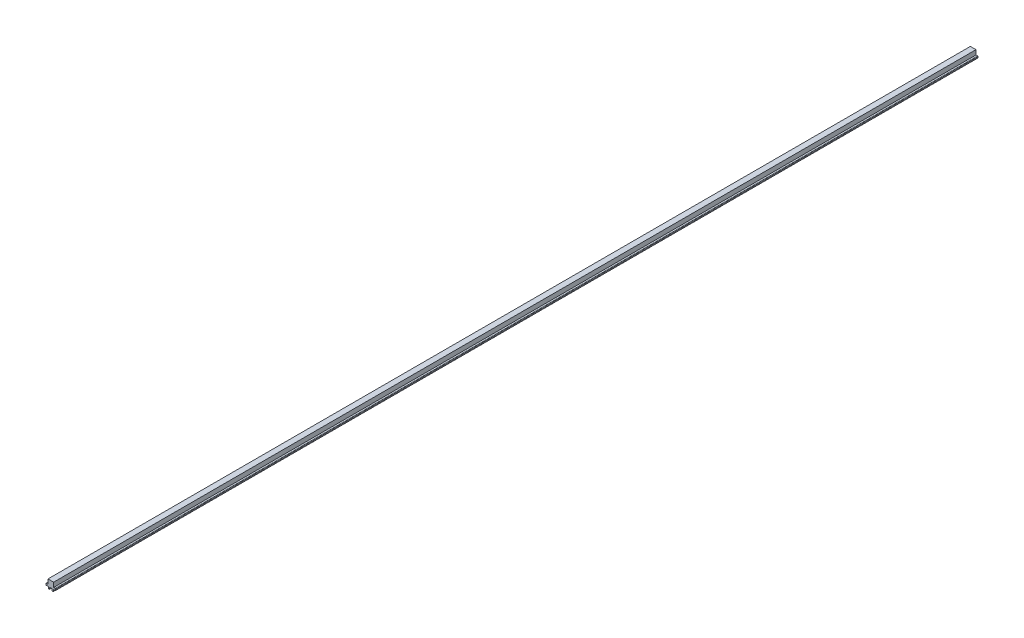
ISO-10303-21;
HEADER;
FILE_DESCRIPTION(('STEP AP214'),'2;1');
FILE_NAME('part.step','',(''),(''),'','','');
FILE_SCHEMA(('AUTOMOTIVE_DESIGN { 1 0 10303 214 1 1 1 1 }'));
ENDSEC;
DATA;
#1=APPLICATION_CONTEXT('core data for automotive mechanical design processes');
#2=APPLICATION_PROTOCOL_DEFINITION('international standard','automotive_design',2000,#1);
#3=PRODUCT_CONTEXT('',#1,'mechanical');
#4=PRODUCT('Part','Part','',(#3));
#5=PRODUCT_RELATED_PRODUCT_CATEGORY('part','',(#4));
#6=PRODUCT_DEFINITION_FORMATION('','',#4);
#7=PRODUCT_DEFINITION_CONTEXT('part definition',#1,'design');
#8=PRODUCT_DEFINITION('design','',#6,#7);
#9=PRODUCT_DEFINITION_SHAPE('','',#8);
#10=(LENGTH_UNIT() NAMED_UNIT(*) SI_UNIT(.MILLI.,.METRE.));
#11=(NAMED_UNIT(*) PLANE_ANGLE_UNIT() SI_UNIT($,.RADIAN.));
#12=(NAMED_UNIT(*) SI_UNIT($,.STERADIAN.) SOLID_ANGLE_UNIT());
#13=UNCERTAINTY_MEASURE_WITH_UNIT(LENGTH_MEASURE(1.E-05),#10,'distance_accuracy_value','');
#14=(GEOMETRIC_REPRESENTATION_CONTEXT(3) GLOBAL_UNCERTAINTY_ASSIGNED_CONTEXT((#13)) GLOBAL_UNIT_ASSIGNED_CONTEXT((#10,
#11,#12)) REPRESENTATION_CONTEXT('',''));
#15=CARTESIAN_POINT('',(0.,0.,0.));
#16=DIRECTION('',(0.,0.,1.));
#17=DIRECTION('',(1.,0.,0.));
#18=AXIS2_PLACEMENT_3D('',#15,#16,#17);
#19=CARTESIAN_POINT('',(0.,5.12684242709043,1000.));
#20=DIRECTION('',(0.,1.,0.));
#21=DIRECTION('',(0.,0.,1.));
#22=AXIS2_PLACEMENT_3D('',#19,#20,#21);
#23=PLANE('',#22);
#24=DIRECTION('',(1.,0.,0.));
#25=VECTOR('',#24,1.);
#26=CARTESIAN_POINT('',(0.,5.12684242709043,0.));
#27=LINE('',#26,#25);
#28=CARTESIAN_POINT('',(-4.46664623906932,5.12684242709043,0.));
#29=VERTEX_POINT('',#28);
#30=CARTESIAN_POINT('',(1.63335376093067,5.12684242709043,0.));
#31=VERTEX_POINT('',#30);
#32=EDGE_CURVE('E207',#29,#31,#27,.T.);
#33=ORIENTED_EDGE('',*,*,#32,.F.);
#34=DIRECTION('',(0.,0.,-1.));
#35=VECTOR('',#34,1.);
#36=CARTESIAN_POINT('',(-4.46664623906932,5.12684242709043,1000.));
#37=LINE('',#36,#35);
#38=CARTESIAN_POINT('',(-4.46664623906932,5.12684242709043,1000.));
#39=VERTEX_POINT('',#38);
#40=EDGE_CURVE('E201',#39,#29,#37,.T.);
#41=ORIENTED_EDGE('',*,*,#40,.F.);
#42=DIRECTION('',(1.,0.,0.));
#43=VECTOR('',#42,1.);
#44=CARTESIAN_POINT('',(0.,5.12684242709043,1000.));
#45=LINE('',#44,#43);
#46=CARTESIAN_POINT('',(1.63335376093067,5.12684242709043,1000.));
#47=VERTEX_POINT('',#46);
#48=EDGE_CURVE('E204',#39,#47,#45,.T.);
#49=ORIENTED_EDGE('',*,*,#48,.T.);
#50=DIRECTION('',(0.,0.,-1.));
#51=VECTOR('',#50,1.);
#52=CARTESIAN_POINT('',(1.63335376093067,5.12684242709043,1000.));
#53=LINE('',#52,#51);
#54=EDGE_CURVE('E265',#47,#31,#53,.T.);
#55=ORIENTED_EDGE('',*,*,#54,.T.);
#56=EDGE_LOOP('',(#33,#41,#49,#55));
#57=FACE_BOUND('',#56,.T.);
#58=ADVANCED_FACE('F36',(#57),#23,.T.);
#59=CARTESIAN_POINT('',(-4.46664623906932,0.,1000.));
#60=DIRECTION('',(1.,0.,0.));
#61=DIRECTION('',(0.,0.,-1.));
#62=AXIS2_PLACEMENT_3D('',#59,#60,#61);
#63=PLANE('',#62);
#64=DIRECTION('',(0.,-1.,0.));
#65=VECTOR('',#64,1.);
#66=CARTESIAN_POINT('',(-4.46664623906932,0.,0.));
#67=LINE('',#66,#65);
#68=CARTESIAN_POINT('',(-4.46664623906932,0.126842427090434,0.));
#69=VERTEX_POINT('',#68);
#70=EDGE_CURVE('E267',#29,#69,#67,.T.);
#71=ORIENTED_EDGE('',*,*,#70,.T.);
#72=DIRECTION('',(0.,0.,-1.));
#73=VECTOR('',#72,1.);
#74=CARTESIAN_POINT('',(-4.46664623906932,0.126842427090434,1000.));
#75=LINE('',#74,#73);
#76=CARTESIAN_POINT('',(-4.46664623906932,0.126842427090434,1000.));
#77=VERTEX_POINT('',#76);
#78=EDGE_CURVE('E211',#77,#69,#75,.T.);
#79=ORIENTED_EDGE('',*,*,#78,.F.);
#80=DIRECTION('',(0.,-1.,0.));
#81=VECTOR('',#80,1.);
#82=CARTESIAN_POINT('',(-4.46664623906932,0.,1000.));
#83=LINE('',#82,#81);
#84=EDGE_CURVE('E214',#39,#77,#83,.T.);
#85=ORIENTED_EDGE('',*,*,#84,.F.);
#86=ORIENTED_EDGE('',*,*,#40,.T.);
#87=EDGE_LOOP('',(#71,#79,#85,#86));
#88=FACE_BOUND('',#87,.T.);
#89=ADVANCED_FACE('F215',(#88),#63,.F.);
#90=CARTESIAN_POINT('',(0.,0.126842427090434,1000.));
#91=DIRECTION('',(0.,-1.,0.));
#92=DIRECTION('',(0.,0.,-1.));
#93=AXIS2_PLACEMENT_3D('',#90,#91,#92);
#94=PLANE('',#93);
#95=DIRECTION('',(-1.,0.,0.));
#96=VECTOR('',#95,1.);
#97=CARTESIAN_POINT('',(0.,0.126842427090434,0.));
#98=LINE('',#97,#96);
#99=CARTESIAN_POINT('',(-6.16664623906933,0.126842427090434,0.));
#100=VERTEX_POINT('',#99);
#101=EDGE_CURVE('E269',#69,#100,#98,.T.);
#102=ORIENTED_EDGE('',*,*,#101,.T.);
#103=DIRECTION('',(0.,0.,-1.));
#104=VECTOR('',#103,1.);
#105=CARTESIAN_POINT('',(-6.16664623906933,0.126842427090434,1000.));
#106=LINE('',#105,#104);
#107=CARTESIAN_POINT('',(-6.16664623906933,0.126842427090434,1000.));
#108=VERTEX_POINT('',#107);
#109=EDGE_CURVE('E351',#100,#108,#106,.F.);
#110=ORIENTED_EDGE('',*,*,#109,.T.);
#111=DIRECTION('',(-1.,0.,0.));
#112=VECTOR('',#111,1.);
#113=CARTESIAN_POINT('',(0.,0.126842427090434,1000.));
#114=LINE('',#113,#112);
#115=EDGE_CURVE('E219',#77,#108,#114,.T.);
#116=ORIENTED_EDGE('',*,*,#115,.F.);
#117=ORIENTED_EDGE('',*,*,#78,.T.);
#118=EDGE_LOOP('',(#102,#110,#116,#117));
#119=FACE_BOUND('',#118,.T.);
#120=ADVANCED_FACE('F427',(#119),#94,.F.);
#121=CARTESIAN_POINT('',(-6.66664623906933,0.,1000.));
#122=DIRECTION('',(1.,0.,0.));
#123=DIRECTION('',(0.,0.,-1.));
#124=AXIS2_PLACEMENT_3D('',#121,#122,#123);
#125=PLANE('',#124);
#126=DIRECTION('',(0.,-1.,0.));
#127=VECTOR('',#126,1.);
#128=CARTESIAN_POINT('',(-6.66664623906933,0.,0.));
#129=LINE('',#128,#127);
#130=CARTESIAN_POINT('',(-6.66664623906933,-0.373157572909566,0.));
#131=VERTEX_POINT('',#130);
#132=CARTESIAN_POINT('',(-6.66664623906933,-1.37315757290957,0.));
#133=VERTEX_POINT('',#132);
#134=EDGE_CURVE('E272',#131,#133,#129,.T.);
#135=ORIENTED_EDGE('',*,*,#134,.T.);
#136=DIRECTION('',(0.,0.,-1.));
#137=VECTOR('',#136,1.);
#138=CARTESIAN_POINT('',(-6.66664623906933,-1.37315757290957,1000.));
#139=LINE('',#138,#137);
#140=CARTESIAN_POINT('',(-6.66664623906933,-1.37315757290957,1000.));
#141=VERTEX_POINT('',#140);
#142=EDGE_CURVE('E349',#133,#141,#139,.F.);
#143=ORIENTED_EDGE('',*,*,#142,.T.);
#144=DIRECTION('',(0.,-1.,0.));
#145=VECTOR('',#144,1.);
#146=CARTESIAN_POINT('',(-6.66664623906933,0.,1000.));
#147=LINE('',#146,#145);
#148=CARTESIAN_POINT('',(-6.66664623906933,-0.373157572909566,1000.));
#149=VERTEX_POINT('',#148);
#150=EDGE_CURVE('E233',#149,#141,#147,.T.);
#151=ORIENTED_EDGE('',*,*,#150,.F.);
#152=DIRECTION('',(0.,0.,-1.));
#153=VECTOR('',#152,1.);
#154=CARTESIAN_POINT('',(-6.66664623906933,-0.373157572909566,1000.));
#155=LINE('',#154,#153);
#156=EDGE_CURVE('E346',#149,#131,#155,.T.);
#157=ORIENTED_EDGE('',*,*,#156,.T.);
#158=EDGE_LOOP('',(#135,#143,#151,#157));
#159=FACE_BOUND('',#158,.T.);
#160=ADVANCED_FACE('F609',(#159),#125,.F.);
#161=CARTESIAN_POINT('',(0.,-1.87315757290957,1000.));
#162=DIRECTION('',(0.,1.,0.));
#163=DIRECTION('',(0.,0.,1.));
#164=AXIS2_PLACEMENT_3D('',#161,#162,#163);
#165=PLANE('',#164);
#166=DIRECTION('',(1.,0.,0.));
#167=VECTOR('',#166,1.);
#168=CARTESIAN_POINT('',(0.,-1.87315757290957,1000.));
#169=LINE('',#168,#167);
#170=CARTESIAN_POINT('',(-6.16664623906933,-1.87315757290957,1000.));
#171=VERTEX_POINT('',#170);
#172=CARTESIAN_POINT('',(-4.21664623906933,-1.87315757290957,1000.));
#173=VERTEX_POINT('',#172);
#174=EDGE_CURVE('E236',#171,#173,#169,.T.);
#175=ORIENTED_EDGE('',*,*,#174,.F.);
#176=DIRECTION('',(0.,0.,-1.));
#177=VECTOR('',#176,1.);
#178=CARTESIAN_POINT('',(-6.16664623906933,-1.87315757290957,1000.));
#179=LINE('',#178,#177);
#180=CARTESIAN_POINT('',(-6.16664623906933,-1.87315757290957,0.));
#181=VERTEX_POINT('',#180);
#182=EDGE_CURVE('E343',#171,#181,#179,.T.);
#183=ORIENTED_EDGE('',*,*,#182,.T.);
#184=DIRECTION('',(1.,0.,0.));
#185=VECTOR('',#184,1.);
#186=CARTESIAN_POINT('',(0.,-1.87315757290957,0.));
#187=LINE('',#186,#185);
#188=CARTESIAN_POINT('',(-4.21664623906933,-1.87315757290957,0.));
#189=VERTEX_POINT('',#188);
#190=EDGE_CURVE('E275',#181,#189,#187,.T.);
#191=ORIENTED_EDGE('',*,*,#190,.T.);
#192=DIRECTION('',(0.,0.,-1.));
#193=VECTOR('',#192,1.);
#194=CARTESIAN_POINT('',(-4.21664623906933,-1.87315757290957,1000.));
#195=LINE('',#194,#193);
#196=EDGE_CURVE('E314',#173,#189,#195,.T.);
#197=ORIENTED_EDGE('',*,*,#196,.F.);
#198=EDGE_LOOP('',(#175,#183,#191,#197));
#199=FACE_BOUND('',#198,.T.);
#200=ADVANCED_FACE('F548',(#199),#165,.F.);
#201=CARTESIAN_POINT('',(-4.21664623906933,0.,1000.));
#202=DIRECTION('',(1.,0.,0.));
#203=DIRECTION('',(0.,0.,-1.));
#204=AXIS2_PLACEMENT_3D('',#201,#202,#203);
#205=PLANE('',#204);
#206=DIRECTION('',(0.,-1.,0.));
#207=VECTOR('',#206,1.);
#208=CARTESIAN_POINT('',(-4.21664623906933,0.,0.));
#209=LINE('',#208,#207);
#210=CARTESIAN_POINT('',(-4.21664623906933,-3.57315757290957,0.));
#211=VERTEX_POINT('',#210);
#212=EDGE_CURVE('E277',#189,#211,#209,.T.);
#213=ORIENTED_EDGE('',*,*,#212,.T.);
#214=DIRECTION('',(0.,0.,-1.));
#215=VECTOR('',#214,1.);
#216=CARTESIAN_POINT('',(-4.21664623906933,-3.57315757290957,1000.));
#217=LINE('',#216,#215);
#218=CARTESIAN_POINT('',(-4.21664623906933,-3.57315757290957,1000.));
#219=VERTEX_POINT('',#218);
#220=EDGE_CURVE('E44',#211,#219,#217,.F.);
#221=ORIENTED_EDGE('',*,*,#220,.T.);
#222=DIRECTION('',(0.,-1.,0.));
#223=VECTOR('',#222,1.);
#224=CARTESIAN_POINT('',(-4.21664623906933,0.,1000.));
#225=LINE('',#224,#223);
#226=EDGE_CURVE('E238',#173,#219,#225,.T.);
#227=ORIENTED_EDGE('',*,*,#226,.F.);
#228=ORIENTED_EDGE('',*,*,#196,.T.);
#229=EDGE_LOOP('',(#213,#221,#227,#228));
#230=FACE_BOUND('',#229,.T.);
#231=ADVANCED_FACE('F384',(#230),#205,.F.);
#232=CARTESIAN_POINT('',(0.,-4.07315757290957,1000.));
#233=DIRECTION('',(0.,-1.,0.));
#234=DIRECTION('',(0.,0.,-1.));
#235=AXIS2_PLACEMENT_3D('',#232,#233,#234);
#236=PLANE('',#235);
#237=DIRECTION('',(-1.,0.,0.));
#238=VECTOR('',#237,1.);
#239=CARTESIAN_POINT('',(0.,-4.07315757290957,1000.));
#240=LINE('',#239,#238);
#241=CARTESIAN_POINT('',(-3.21664623906933,-4.07315757290957,1000.));
#242=VERTEX_POINT('',#241);
#243=CARTESIAN_POINT('',(-3.71664623906933,-4.07315757290957,1000.));
#244=VERTEX_POINT('',#243);
#245=EDGE_CURVE('E241',#242,#244,#240,.T.);
#246=ORIENTED_EDGE('',*,*,#245,.T.);
#247=DIRECTION('',(0.,0.,-1.));
#248=VECTOR('',#247,1.);
#249=CARTESIAN_POINT('',(-3.71664623906933,-4.07315757290957,0.));
#250=LINE('',#249,#248);
#251=CARTESIAN_POINT('',(-3.71664623906933,-4.07315757290957,0.));
#252=VERTEX_POINT('',#251);
#253=EDGE_CURVE('E379',#244,#252,#250,.T.);
#254=ORIENTED_EDGE('',*,*,#253,.T.);
#255=DIRECTION('',(-1.,0.,0.));
#256=VECTOR('',#255,1.);
#257=CARTESIAN_POINT('',(0.,-4.07315757290957,0.));
#258=LINE('',#257,#256);
#259=CARTESIAN_POINT('',(-3.21664623906933,-4.07315757290957,0.));
#260=VERTEX_POINT('',#259);
#261=EDGE_CURVE('E280',#260,#252,#258,.T.);
#262=ORIENTED_EDGE('',*,*,#261,.F.);
#263=DIRECTION('',(0.,0.,-1.));
#264=VECTOR('',#263,1.);
#265=CARTESIAN_POINT('',(-3.21664623906933,-4.07315757290957,1000.));
#266=LINE('',#265,#264);
#267=EDGE_CURVE('E377',#260,#242,#266,.F.);
#268=ORIENTED_EDGE('',*,*,#267,.T.);
#269=EDGE_LOOP('',(#246,#254,#262,#268));
#270=FACE_BOUND('',#269,.T.);
#271=ADVANCED_FACE('F394',(#270),#236,.T.);
#272=CARTESIAN_POINT('',(-2.71664623906933,0.,1000.));
#273=DIRECTION('',(1.,0.,0.));
#274=DIRECTION('',(0.,0.,-1.));
#275=AXIS2_PLACEMENT_3D('',#272,#273,#274);
#276=PLANE('',#275);
#277=DIRECTION('',(0.,-1.,0.));
#278=VECTOR('',#277,1.);
#279=CARTESIAN_POINT('',(-2.71664623906933,0.,1000.));
#280=LINE('',#279,#278);
#281=CARTESIAN_POINT('',(-2.71664623906933,-1.87315757290957,1000.));
#282=VERTEX_POINT('',#281);
#283=CARTESIAN_POINT('',(-2.71664623906933,-3.57315757290957,1000.));
#284=VERTEX_POINT('',#283);
#285=EDGE_CURVE('E244',#282,#284,#280,.T.);
#286=ORIENTED_EDGE('',*,*,#285,.T.);
#287=DIRECTION('',(0.,0.,-1.));
#288=VECTOR('',#287,1.);
#289=CARTESIAN_POINT('',(-2.71664623906933,-3.57315757290957,1000.));
#290=LINE('',#289,#288);
#291=CARTESIAN_POINT('',(-2.71664623906933,-3.57315757290957,0.));
#292=VERTEX_POINT('',#291);
#293=EDGE_CURVE('E11',#284,#292,#290,.T.);
#294=ORIENTED_EDGE('',*,*,#293,.T.);
#295=DIRECTION('',(0.,-1.,0.));
#296=VECTOR('',#295,1.);
#297=CARTESIAN_POINT('',(-2.71664623906933,0.,0.));
#298=LINE('',#297,#296);
#299=CARTESIAN_POINT('',(-2.71664623906933,-1.87315757290957,0.));
#300=VERTEX_POINT('',#299);
#301=EDGE_CURVE('E283',#300,#292,#298,.T.);
#302=ORIENTED_EDGE('',*,*,#301,.F.);
#303=DIRECTION('',(0.,0.,-1.));
#304=VECTOR('',#303,1.);
#305=CARTESIAN_POINT('',(-2.71664623906933,-1.87315757290957,1000.));
#306=LINE('',#305,#304);
#307=EDGE_CURVE('E312',#282,#300,#306,.T.);
#308=ORIENTED_EDGE('',*,*,#307,.F.);
#309=EDGE_LOOP('',(#286,#294,#302,#308));
#310=FACE_BOUND('',#309,.T.);
#311=ADVANCED_FACE('F403',(#310),#276,.T.);
#312=CARTESIAN_POINT('',(0.,-1.87315757290957,1000.));
#313=DIRECTION('',(0.,1.,0.));
#314=DIRECTION('',(0.,0.,1.));
#315=AXIS2_PLACEMENT_3D('',#312,#313,#314);
#316=PLANE('',#315);
#317=DIRECTION('',(1.,0.,0.));
#318=VECTOR('',#317,1.);
#319=CARTESIAN_POINT('',(0.,-1.87315757290957,0.));
#320=LINE('',#319,#318);
#321=CARTESIAN_POINT('',(-0.116646239069324,-1.87315757290957,0.));
#322=VERTEX_POINT('',#321);
#323=EDGE_CURVE('E286',#300,#322,#320,.T.);
#324=ORIENTED_EDGE('',*,*,#323,.T.);
#325=DIRECTION('',(0.,0.,-1.));
#326=VECTOR('',#325,1.);
#327=CARTESIAN_POINT('',(-0.116646239069324,-1.87315757290957,1000.));
#328=LINE('',#327,#326);
#329=CARTESIAN_POINT('',(-0.116646239069324,-1.87315757290957,1000.));
#330=VERTEX_POINT('',#329);
#331=EDGE_CURVE('E309',#330,#322,#328,.T.);
#332=ORIENTED_EDGE('',*,*,#331,.F.);
#333=DIRECTION('',(1.,0.,0.));
#334=VECTOR('',#333,1.);
#335=CARTESIAN_POINT('',(0.,-1.87315757290957,1000.));
#336=LINE('',#335,#334);
#337=EDGE_CURVE('E246',#282,#330,#336,.T.);
#338=ORIENTED_EDGE('',*,*,#337,.F.);
#339=ORIENTED_EDGE('',*,*,#307,.T.);
#340=EDGE_LOOP('',(#324,#332,#338,#339));
#341=FACE_BOUND('',#340,.T.);
#342=ADVANCED_FACE('F408',(#341),#316,.F.);
#343=CARTESIAN_POINT('',(-0.116646239069324,0.,1000.));
#344=DIRECTION('',(1.,0.,0.));
#345=DIRECTION('',(0.,0.,-1.));
#346=AXIS2_PLACEMENT_3D('',#343,#344,#345);
#347=PLANE('',#346);
#348=DIRECTION('',(0.,-1.,0.));
#349=VECTOR('',#348,1.);
#350=CARTESIAN_POINT('',(-0.116646239069324,0.,0.));
#351=LINE('',#350,#349);
#352=CARTESIAN_POINT('',(-0.116646239069324,-3.57315757290957,0.));
#353=VERTEX_POINT('',#352);
#354=EDGE_CURVE('E288',#322,#353,#351,.T.);
#355=ORIENTED_EDGE('',*,*,#354,.T.);
#356=DIRECTION('',(0.,0.,-1.));
#357=VECTOR('',#356,1.);
#358=CARTESIAN_POINT('',(-0.116646239069324,-3.57315757290957,1000.));
#359=LINE('',#358,#357);
#360=CARTESIAN_POINT('',(-0.116646239069324,-3.57315757290957,1000.));
#361=VERTEX_POINT('',#360);
#362=EDGE_CURVE('E51',#353,#361,#359,.F.);
#363=ORIENTED_EDGE('',*,*,#362,.T.);
#364=DIRECTION('',(0.,-1.,0.));
#365=VECTOR('',#364,1.);
#366=CARTESIAN_POINT('',(-0.116646239069324,0.,1000.));
#367=LINE('',#366,#365);
#368=EDGE_CURVE('E248',#330,#361,#367,.T.);
#369=ORIENTED_EDGE('',*,*,#368,.F.);
#370=ORIENTED_EDGE('',*,*,#331,.T.);
#371=EDGE_LOOP('',(#355,#363,#369,#370));
#372=FACE_BOUND('',#371,.T.);
#373=ADVANCED_FACE('F410',(#372),#347,.F.);
#374=CARTESIAN_POINT('',(0.,-4.07315757290957,1000.));
#375=DIRECTION('',(0.,1.,0.));
#376=DIRECTION('',(0.,0.,1.));
#377=AXIS2_PLACEMENT_3D('',#374,#375,#376);
#378=PLANE('',#377);
#379=DIRECTION('',(1.,0.,0.));
#380=VECTOR('',#379,1.);
#381=CARTESIAN_POINT('',(0.,-4.07315757290957,0.));
#382=LINE('',#381,#380);
#383=CARTESIAN_POINT('',(0.383353760930676,-4.07315757290957,0.));
#384=VERTEX_POINT('',#383);
#385=CARTESIAN_POINT('',(0.883353760930676,-4.07315757290957,0.));
#386=VERTEX_POINT('',#385);
#387=EDGE_CURVE('E290',#384,#386,#382,.T.);
#388=ORIENTED_EDGE('',*,*,#387,.T.);
#389=DIRECTION('',(0.,0.,-1.));
#390=VECTOR('',#389,1.);
#391=CARTESIAN_POINT('',(0.883353760930676,-4.07315757290957,1000.));
#392=LINE('',#391,#390);
#393=CARTESIAN_POINT('',(0.883353760930676,-4.07315757290957,1000.));
#394=VERTEX_POINT('',#393);
#395=EDGE_CURVE('E367',#386,#394,#392,.F.);
#396=ORIENTED_EDGE('',*,*,#395,.T.);
#397=DIRECTION('',(1.,0.,0.));
#398=VECTOR('',#397,1.);
#399=CARTESIAN_POINT('',(0.,-4.07315757290957,1000.));
#400=LINE('',#399,#398);
#401=CARTESIAN_POINT('',(0.383353760930676,-4.07315757290957,1000.));
#402=VERTEX_POINT('',#401);
#403=EDGE_CURVE('E250',#402,#394,#400,.T.);
#404=ORIENTED_EDGE('',*,*,#403,.F.);
#405=DIRECTION('',(0.,0.,-1.));
#406=VECTOR('',#405,1.);
#407=CARTESIAN_POINT('',(0.383353760930676,-4.07315757290957,1000.));
#408=LINE('',#407,#406);
#409=EDGE_CURVE('E364',#402,#384,#408,.T.);
#410=ORIENTED_EDGE('',*,*,#409,.T.);
#411=EDGE_LOOP('',(#388,#396,#404,#410));
#412=FACE_BOUND('',#411,.T.);
#413=ADVANCED_FACE('F412',(#412),#378,.F.);
#414=CARTESIAN_POINT('',(1.38335376093068,0.,1000.));
#415=DIRECTION('',(1.,0.,0.));
#416=DIRECTION('',(0.,0.,-1.));
#417=AXIS2_PLACEMENT_3D('',#414,#415,#416);
#418=PLANE('',#417);
#419=DIRECTION('',(0.,-1.,0.));
#420=VECTOR('',#419,1.);
#421=CARTESIAN_POINT('',(1.38335376093068,0.,1000.));
#422=LINE('',#421,#420);
#423=CARTESIAN_POINT('',(1.38335376093068,-1.87315757290957,1000.));
#424=VERTEX_POINT('',#423);
#425=CARTESIAN_POINT('',(1.38335376093068,-3.57315757290957,1000.));
#426=VERTEX_POINT('',#425);
#427=EDGE_CURVE('E252',#424,#426,#422,.T.);
#428=ORIENTED_EDGE('',*,*,#427,.T.);
#429=DIRECTION('',(0.,0.,-1.));
#430=VECTOR('',#429,1.);
#431=CARTESIAN_POINT('',(1.38335376093068,-3.57315757290957,0.));
#432=LINE('',#431,#430);
#433=CARTESIAN_POINT('',(1.38335376093068,-3.57315757290957,0.));
#434=VERTEX_POINT('',#433);
#435=EDGE_CURVE('E353',#426,#434,#432,.T.);
#436=ORIENTED_EDGE('',*,*,#435,.T.);
#437=DIRECTION('',(0.,-1.,0.));
#438=VECTOR('',#437,1.);
#439=CARTESIAN_POINT('',(1.38335376093068,0.,0.));
#440=LINE('',#439,#438);
#441=CARTESIAN_POINT('',(1.38335376093068,-1.87315757290957,0.));
#442=VERTEX_POINT('',#441);
#443=EDGE_CURVE('E293',#442,#434,#440,.T.);
#444=ORIENTED_EDGE('',*,*,#443,.F.);
#445=DIRECTION('',(0.,0.,-1.));
#446=VECTOR('',#445,1.);
#447=CARTESIAN_POINT('',(1.38335376093068,-1.87315757290957,1000.));
#448=LINE('',#447,#446);
#449=EDGE_CURVE('E307',#424,#442,#448,.T.);
#450=ORIENTED_EDGE('',*,*,#449,.F.);
#451=EDGE_LOOP('',(#428,#436,#444,#450));
#452=FACE_BOUND('',#451,.T.);
#453=ADVANCED_FACE('F418',(#452),#418,.T.);
#454=CARTESIAN_POINT('',(0.,-1.87315757290957,1000.));
#455=DIRECTION('',(0.,1.,0.));
#456=DIRECTION('',(0.,0.,1.));
#457=AXIS2_PLACEMENT_3D('',#454,#455,#456);
#458=PLANE('',#457);
#459=DIRECTION('',(1.,0.,0.));
#460=VECTOR('',#459,1.);
#461=CARTESIAN_POINT('',(0.,-1.87315757290957,0.));
#462=LINE('',#461,#460);
#463=CARTESIAN_POINT('',(3.33335376093068,-1.87315757290957,0.));
#464=VERTEX_POINT('',#463);
#465=EDGE_CURVE('E296',#442,#464,#462,.T.);
#466=ORIENTED_EDGE('',*,*,#465,.T.);
#467=DIRECTION('',(0.,0.,-1.));
#468=VECTOR('',#467,1.);
#469=CARTESIAN_POINT('',(3.33335376093068,-1.87315757290957,1000.));
#470=LINE('',#469,#468);
#471=CARTESIAN_POINT('',(3.33335376093068,-1.87315757290957,1000.));
#472=VERTEX_POINT('',#471);
#473=EDGE_CURVE('E330',#464,#472,#470,.F.);
#474=ORIENTED_EDGE('',*,*,#473,.T.);
#475=DIRECTION('',(1.,0.,0.));
#476=VECTOR('',#475,1.);
#477=CARTESIAN_POINT('',(0.,-1.87315757290957,1000.));
#478=LINE('',#477,#476);
#479=EDGE_CURVE('E255',#424,#472,#478,.T.);
#480=ORIENTED_EDGE('',*,*,#479,.F.);
#481=ORIENTED_EDGE('',*,*,#449,.T.);
#482=EDGE_LOOP('',(#466,#474,#480,#481));
#483=FACE_BOUND('',#482,.T.);
#484=ADVANCED_FACE('F508',(#483),#458,.F.);
#485=CARTESIAN_POINT('',(3.83335376093068,0.,1000.));
#486=DIRECTION('',(1.,0.,0.));
#487=DIRECTION('',(0.,0.,-1.));
#488=AXIS2_PLACEMENT_3D('',#485,#486,#487);
#489=PLANE('',#488);
#490=DIRECTION('',(0.,-1.,0.));
#491=VECTOR('',#490,1.);
#492=CARTESIAN_POINT('',(3.83335376093068,0.,1000.));
#493=LINE('',#492,#491);
#494=CARTESIAN_POINT('',(3.83335376093068,-0.373157572909566,1000.));
#495=VERTEX_POINT('',#494);
#496=CARTESIAN_POINT('',(3.83335376093068,-1.37315757290957,1000.));
#497=VERTEX_POINT('',#496);
#498=EDGE_CURVE('E258',#495,#497,#493,.T.);
#499=ORIENTED_EDGE('',*,*,#498,.T.);
#500=DIRECTION('',(0.,0.,-1.));
#501=VECTOR('',#500,1.);
#502=CARTESIAN_POINT('',(3.83335376093068,-1.37315757290957,0.));
#503=LINE('',#502,#501);
#504=CARTESIAN_POINT('',(3.83335376093068,-1.37315757290957,0.));
#505=VERTEX_POINT('',#504);
#506=EDGE_CURVE('E319',#497,#505,#503,.T.);
#507=ORIENTED_EDGE('',*,*,#506,.T.);
#508=DIRECTION('',(0.,-1.,0.));
#509=VECTOR('',#508,1.);
#510=CARTESIAN_POINT('',(3.83335376093068,0.,0.));
#511=LINE('',#510,#509);
#512=CARTESIAN_POINT('',(3.83335376093068,-0.373157572909566,0.));
#513=VERTEX_POINT('',#512);
#514=EDGE_CURVE('E299',#513,#505,#511,.T.);
#515=ORIENTED_EDGE('',*,*,#514,.F.);
#516=DIRECTION('',(0.,0.,-1.));
#517=VECTOR('',#516,1.);
#518=CARTESIAN_POINT('',(3.83335376093068,-0.373157572909566,1000.));
#519=LINE('',#518,#517);
#520=EDGE_CURVE('E210',#513,#495,#519,.F.);
#521=ORIENTED_EDGE('',*,*,#520,.T.);
#522=EDGE_LOOP('',(#499,#507,#515,#521));
#523=FACE_BOUND('',#522,.T.);
#524=ADVANCED_FACE('F582',(#523),#489,.T.);
#525=CARTESIAN_POINT('',(0.,0.126842427090434,1000.));
#526=DIRECTION('',(0.,1.,0.));
#527=DIRECTION('',(0.,0.,1.));
#528=AXIS2_PLACEMENT_3D('',#525,#526,#527);
#529=PLANE('',#528);
#530=DIRECTION('',(1.,0.,0.));
#531=VECTOR('',#530,1.);
#532=CARTESIAN_POINT('',(0.,0.126842427090434,1000.));
#533=LINE('',#532,#531);
#534=CARTESIAN_POINT('',(1.63335376093067,0.126842427090434,1000.));
#535=VERTEX_POINT('',#534);
#536=CARTESIAN_POINT('',(3.33335376093068,0.126842427090434,1000.));
#537=VERTEX_POINT('',#536);
#538=EDGE_CURVE('E261',#535,#537,#533,.T.);
#539=ORIENTED_EDGE('',*,*,#538,.T.);
#540=DIRECTION('',(0.,0.,-1.));
#541=VECTOR('',#540,1.);
#542=CARTESIAN_POINT('',(3.33335376093068,0.126842427090434,1000.));
#543=LINE('',#542,#541);
#544=CARTESIAN_POINT('',(3.33335376093068,0.126842427090434,0.));
#545=VERTEX_POINT('',#544);
#546=EDGE_CURVE('E340',#537,#545,#543,.T.);
#547=ORIENTED_EDGE('',*,*,#546,.T.);
#548=DIRECTION('',(1.,0.,0.));
#549=VECTOR('',#548,1.);
#550=CARTESIAN_POINT('',(0.,0.126842427090434,0.));
#551=LINE('',#550,#549);
#552=CARTESIAN_POINT('',(1.63335376093067,0.126842427090434,0.));
#553=VERTEX_POINT('',#552);
#554=EDGE_CURVE('E229',#553,#545,#551,.T.);
#555=ORIENTED_EDGE('',*,*,#554,.F.);
#556=DIRECTION('',(0.,0.,-1.));
#557=VECTOR('',#556,1.);
#558=CARTESIAN_POINT('',(1.63335376093067,0.126842427090434,1000.));
#559=LINE('',#558,#557);
#560=EDGE_CURVE('E305',#535,#553,#559,.T.);
#561=ORIENTED_EDGE('',*,*,#560,.F.);
#562=EDGE_LOOP('',(#539,#547,#555,#561));
#563=FACE_BOUND('',#562,.T.);
#564=ADVANCED_FACE('F577',(#563),#529,.T.);
#565=CARTESIAN_POINT('',(1.63335376093067,0.,1000.));
#566=DIRECTION('',(1.,0.,0.));
#567=DIRECTION('',(0.,0.,-1.));
#568=AXIS2_PLACEMENT_3D('',#565,#566,#567);
#569=PLANE('',#568);
#570=DIRECTION('',(0.,-1.,0.));
#571=VECTOR('',#570,1.);
#572=CARTESIAN_POINT('',(1.63335376093067,0.,0.));
#573=LINE('',#572,#571);
#574=EDGE_CURVE('E226',#31,#553,#573,.T.);
#575=ORIENTED_EDGE('',*,*,#574,.F.);
#576=ORIENTED_EDGE('',*,*,#54,.F.);
#577=DIRECTION('',(0.,-1.,0.));
#578=VECTOR('',#577,1.);
#579=CARTESIAN_POINT('',(1.63335376093067,0.,1000.));
#580=LINE('',#579,#578);
#581=EDGE_CURVE('E225',#47,#535,#580,.T.);
#582=ORIENTED_EDGE('',*,*,#581,.T.);
#583=ORIENTED_EDGE('',*,*,#560,.T.);
#584=EDGE_LOOP('',(#575,#576,#582,#583));
#585=FACE_BOUND('',#584,.T.);
#586=ADVANCED_FACE('F496',(#585),#569,.T.);
#587=CARTESIAN_POINT('',(0.,0.,1000.));
#588=DIRECTION('',(0.,0.,1.));
#589=DIRECTION('',(1.,0.,0.));
#590=AXIS2_PLACEMENT_3D('',#587,#588,#589);
#591=PLANE('',#590);
#592=ORIENTED_EDGE('',*,*,#403,.T.);
#593=CARTESIAN_POINT('',(0.883353760930676,-3.57315757290957,1000.));
#594=DIRECTION('',(0.,0.,1.));
#595=DIRECTION('',(1.,0.,0.));
#596=AXIS2_PLACEMENT_3D('',#593,#594,#595);
#597=CIRCLE('',#596,0.5);
#598=EDGE_CURVE('E374',#394,#426,#597,.T.);
#599=ORIENTED_EDGE('',*,*,#598,.T.);
#600=ORIENTED_EDGE('',*,*,#427,.F.);
#601=ORIENTED_EDGE('',*,*,#479,.T.);
#602=CARTESIAN_POINT('',(3.33335376093068,-1.37315757290957,1000.));
#603=DIRECTION('',(0.,0.,1.));
#604=DIRECTION('',(1.,0.,0.));
#605=AXIS2_PLACEMENT_3D('',#602,#603,#604);
#606=CIRCLE('',#605,0.5);
#607=EDGE_CURVE('E338',#472,#497,#606,.T.);
#608=ORIENTED_EDGE('',*,*,#607,.T.);
#609=ORIENTED_EDGE('',*,*,#498,.F.);
#610=CARTESIAN_POINT('',(3.33335376093068,-0.373157572909566,1000.));
#611=DIRECTION('',(0.,0.,1.));
#612=DIRECTION('',(1.,0.,0.));
#613=AXIS2_PLACEMENT_3D('',#610,#611,#612);
#614=CIRCLE('',#613,0.5);
#615=EDGE_CURVE('E336',#495,#537,#614,.T.);
#616=ORIENTED_EDGE('',*,*,#615,.T.);
#617=ORIENTED_EDGE('',*,*,#538,.F.);
#618=ORIENTED_EDGE('',*,*,#581,.F.);
#619=ORIENTED_EDGE('',*,*,#48,.F.);
#620=ORIENTED_EDGE('',*,*,#84,.T.);
#621=ORIENTED_EDGE('',*,*,#115,.T.);
#622=CARTESIAN_POINT('',(-6.16664623906933,-0.373157572909566,1000.));
#623=DIRECTION('',(0.,0.,1.));
#624=DIRECTION('',(1.,0.,0.));
#625=AXIS2_PLACEMENT_3D('',#622,#623,#624);
#626=CIRCLE('',#625,0.5);
#627=EDGE_CURVE('E332',#108,#149,#626,.T.);
#628=ORIENTED_EDGE('',*,*,#627,.T.);
#629=ORIENTED_EDGE('',*,*,#150,.T.);
#630=CARTESIAN_POINT('',(-6.16664623906933,-1.37315757290957,1000.));
#631=DIRECTION('',(0.,0.,1.));
#632=DIRECTION('',(1.,0.,0.));
#633=AXIS2_PLACEMENT_3D('',#630,#631,#632);
#634=CIRCLE('',#633,0.5);
#635=EDGE_CURVE('E334',#141,#171,#634,.T.);
#636=ORIENTED_EDGE('',*,*,#635,.T.);
#637=ORIENTED_EDGE('',*,*,#174,.T.);
#638=ORIENTED_EDGE('',*,*,#226,.T.);
#639=CARTESIAN_POINT('',(-3.71664623906933,-3.57315757290957,1000.));
#640=DIRECTION('',(0.,0.,1.));
#641=DIRECTION('',(1.,0.,0.));
#642=AXIS2_PLACEMENT_3D('',#639,#640,#641);
#643=CIRCLE('',#642,0.5);
#644=EDGE_CURVE('E370',#219,#244,#643,.T.);
#645=ORIENTED_EDGE('',*,*,#644,.T.);
#646=ORIENTED_EDGE('',*,*,#245,.F.);
#647=CARTESIAN_POINT('',(-3.21664623906933,-3.57315757290957,1000.));
#648=DIRECTION('',(0.,0.,1.));
#649=DIRECTION('',(1.,0.,0.));
#650=AXIS2_PLACEMENT_3D('',#647,#648,#649);
#651=CIRCLE('',#650,0.5);
#652=EDGE_CURVE('E59',#242,#284,#651,.T.);
#653=ORIENTED_EDGE('',*,*,#652,.T.);
#654=ORIENTED_EDGE('',*,*,#285,.F.);
#655=ORIENTED_EDGE('',*,*,#337,.T.);
#656=ORIENTED_EDGE('',*,*,#368,.T.);
#657=CARTESIAN_POINT('',(0.383353760930676,-3.57315757290957,1000.));
#658=DIRECTION('',(0.,0.,1.));
#659=DIRECTION('',(1.,0.,0.));
#660=AXIS2_PLACEMENT_3D('',#657,#658,#659);
#661=CIRCLE('',#660,0.5);
#662=EDGE_CURVE('E372',#361,#402,#661,.T.);
#663=ORIENTED_EDGE('',*,*,#662,.T.);
#664=EDGE_LOOP('',(#592,#599,#600,#601,#608,#609,#616,#617,#618,#619,#620,#621,#628,#629,#636,
#637,#638,#645,#646,#653,#654,#655,#656,#663));
#665=FACE_BOUND('',#664,.T.);
#666=ADVANCED_FACE('F222',(#665),#591,.T.);
#667=CARTESIAN_POINT('',(0.,0.,0.));
#668=DIRECTION('',(0.,0.,1.));
#669=DIRECTION('',(1.,0.,0.));
#670=AXIS2_PLACEMENT_3D('',#667,#668,#669);
#671=PLANE('',#670);
#672=ORIENTED_EDGE('',*,*,#443,.T.);
#673=CARTESIAN_POINT('',(0.883353760930676,-3.57315757290957,0.));
#674=DIRECTION('',(0.,0.,1.));
#675=DIRECTION('',(1.,0.,0.));
#676=AXIS2_PLACEMENT_3D('',#673,#674,#675);
#677=CIRCLE('',#676,0.5);
#678=EDGE_CURVE('E362',#434,#386,#677,.F.);
#679=ORIENTED_EDGE('',*,*,#678,.T.);
#680=ORIENTED_EDGE('',*,*,#387,.F.);
#681=CARTESIAN_POINT('',(0.383353760930676,-3.57315757290957,0.));
#682=DIRECTION('',(0.,0.,1.));
#683=DIRECTION('',(1.,0.,0.));
#684=AXIS2_PLACEMENT_3D('',#681,#682,#683);
#685=CIRCLE('',#684,0.5);
#686=EDGE_CURVE('E360',#384,#353,#685,.F.);
#687=ORIENTED_EDGE('',*,*,#686,.T.);
#688=ORIENTED_EDGE('',*,*,#354,.F.);
#689=ORIENTED_EDGE('',*,*,#323,.F.);
#690=ORIENTED_EDGE('',*,*,#301,.T.);
#691=CARTESIAN_POINT('',(-3.21664623906933,-3.57315757290957,0.));
#692=DIRECTION('',(0.,0.,1.));
#693=DIRECTION('',(1.,0.,0.));
#694=AXIS2_PLACEMENT_3D('',#691,#692,#693);
#695=CIRCLE('',#694,0.5);
#696=EDGE_CURVE('E356',#292,#260,#695,.F.);
#697=ORIENTED_EDGE('',*,*,#696,.T.);
#698=ORIENTED_EDGE('',*,*,#261,.T.);
#699=CARTESIAN_POINT('',(-3.71664623906933,-3.57315757290957,0.));
#700=DIRECTION('',(0.,0.,1.));
#701=DIRECTION('',(1.,0.,0.));
#702=AXIS2_PLACEMENT_3D('',#699,#700,#701);
#703=CIRCLE('',#702,0.5);
#704=EDGE_CURVE('E358',#252,#211,#703,.F.);
#705=ORIENTED_EDGE('',*,*,#704,.T.);
#706=ORIENTED_EDGE('',*,*,#212,.F.);
#707=ORIENTED_EDGE('',*,*,#190,.F.);
#708=CARTESIAN_POINT('',(-6.16664623906933,-1.37315757290957,0.));
#709=DIRECTION('',(0.,0.,1.));
#710=DIRECTION('',(1.,0.,0.));
#711=AXIS2_PLACEMENT_3D('',#708,#709,#710);
#712=CIRCLE('',#711,0.5);
#713=EDGE_CURVE('E324',#181,#133,#712,.F.);
#714=ORIENTED_EDGE('',*,*,#713,.T.);
#715=ORIENTED_EDGE('',*,*,#134,.F.);
#716=CARTESIAN_POINT('',(-6.16664623906933,-0.373157572909566,0.));
#717=DIRECTION('',(0.,0.,1.));
#718=DIRECTION('',(1.,0.,0.));
#719=AXIS2_PLACEMENT_3D('',#716,#717,#718);
#720=CIRCLE('',#719,0.5);
#721=EDGE_CURVE('E322',#131,#100,#720,.F.);
#722=ORIENTED_EDGE('',*,*,#721,.T.);
#723=ORIENTED_EDGE('',*,*,#101,.F.);
#724=ORIENTED_EDGE('',*,*,#70,.F.);
#725=ORIENTED_EDGE('',*,*,#32,.T.);
#726=ORIENTED_EDGE('',*,*,#574,.T.);
#727=ORIENTED_EDGE('',*,*,#554,.T.);
#728=CARTESIAN_POINT('',(3.33335376093068,-0.373157572909566,0.));
#729=DIRECTION('',(0.,0.,1.));
#730=DIRECTION('',(1.,0.,0.));
#731=AXIS2_PLACEMENT_3D('',#728,#729,#730);
#732=CIRCLE('',#731,0.5);
#733=EDGE_CURVE('E326',#545,#513,#732,.F.);
#734=ORIENTED_EDGE('',*,*,#733,.T.);
#735=ORIENTED_EDGE('',*,*,#514,.T.);
#736=CARTESIAN_POINT('',(3.33335376093068,-1.37315757290957,0.));
#737=DIRECTION('',(0.,0.,1.));
#738=DIRECTION('',(1.,0.,0.));
#739=AXIS2_PLACEMENT_3D('',#736,#737,#738);
#740=CIRCLE('',#739,0.5);
#741=EDGE_CURVE('E328',#505,#464,#740,.F.);
#742=ORIENTED_EDGE('',*,*,#741,.T.);
#743=ORIENTED_EDGE('',*,*,#465,.F.);
#744=EDGE_LOOP('',(#672,#679,#680,#687,#688,#689,#690,#697,#698,#705,#706,#707,#714,#715,#722,
#723,#724,#725,#726,#727,#734,#735,#742,#743));
#745=FACE_BOUND('',#744,.T.);
#746=ADVANCED_FACE('F397',(#745),#671,.F.);
#747=CARTESIAN_POINT('',(3.33335376093068,-1.37315757290957,1000.));
#748=DIRECTION('',(0.,0.,1.));
#749=DIRECTION('',(1.,0.,0.));
#750=AXIS2_PLACEMENT_3D('',#747,#748,#749);
#751=CYLINDRICAL_SURFACE('',#750,0.5);
#752=ORIENTED_EDGE('',*,*,#607,.F.);
#753=ORIENTED_EDGE('',*,*,#473,.F.);
#754=ORIENTED_EDGE('',*,*,#741,.F.);
#755=ORIENTED_EDGE('',*,*,#506,.F.);
#756=EDGE_LOOP('',(#752,#753,#754,#755));
#757=FACE_BOUND('',#756,.T.);
#758=ADVANCED_FACE('F431',(#757),#751,.T.);
#759=CARTESIAN_POINT('',(3.33335376093068,-0.373157572909566,1000.));
#760=DIRECTION('',(0.,0.,-1.));
#761=DIRECTION('',(-1.,0.,0.));
#762=AXIS2_PLACEMENT_3D('',#759,#760,#761);
#763=CYLINDRICAL_SURFACE('',#762,0.5);
#764=ORIENTED_EDGE('',*,*,#615,.F.);
#765=ORIENTED_EDGE('',*,*,#520,.F.);
#766=ORIENTED_EDGE('',*,*,#733,.F.);
#767=ORIENTED_EDGE('',*,*,#546,.F.);
#768=EDGE_LOOP('',(#764,#765,#766,#767));
#769=FACE_BOUND('',#768,.T.);
#770=ADVANCED_FACE('F434',(#769),#763,.T.);
#771=CARTESIAN_POINT('',(-6.16664623906933,-1.37315757290957,1000.));
#772=DIRECTION('',(0.,0.,-1.));
#773=DIRECTION('',(-1.,0.,0.));
#774=AXIS2_PLACEMENT_3D('',#771,#772,#773);
#775=CYLINDRICAL_SURFACE('',#774,0.5);
#776=ORIENTED_EDGE('',*,*,#635,.F.);
#777=ORIENTED_EDGE('',*,*,#142,.F.);
#778=ORIENTED_EDGE('',*,*,#713,.F.);
#779=ORIENTED_EDGE('',*,*,#182,.F.);
#780=EDGE_LOOP('',(#776,#777,#778,#779));
#781=FACE_BOUND('',#780,.T.);
#782=ADVANCED_FACE('F438',(#781),#775,.T.);
#783=CARTESIAN_POINT('',(-6.16664623906933,-0.373157572909566,1000.));
#784=DIRECTION('',(0.,0.,-1.));
#785=DIRECTION('',(-1.,0.,0.));
#786=AXIS2_PLACEMENT_3D('',#783,#784,#785);
#787=CYLINDRICAL_SURFACE('',#786,0.5);
#788=ORIENTED_EDGE('',*,*,#627,.F.);
#789=ORIENTED_EDGE('',*,*,#109,.F.);
#790=ORIENTED_EDGE('',*,*,#721,.F.);
#791=ORIENTED_EDGE('',*,*,#156,.F.);
#792=EDGE_LOOP('',(#788,#789,#790,#791));
#793=FACE_BOUND('',#792,.T.);
#794=ADVANCED_FACE('F442',(#793),#787,.T.);
#795=CARTESIAN_POINT('',(0.883353760930676,-3.57315757290957,1000.));
#796=DIRECTION('',(0.,0.,1.));
#797=DIRECTION('',(1.,0.,0.));
#798=AXIS2_PLACEMENT_3D('',#795,#796,#797);
#799=CYLINDRICAL_SURFACE('',#798,0.5);
#800=ORIENTED_EDGE('',*,*,#598,.F.);
#801=ORIENTED_EDGE('',*,*,#395,.F.);
#802=ORIENTED_EDGE('',*,*,#678,.F.);
#803=ORIENTED_EDGE('',*,*,#435,.F.);
#804=EDGE_LOOP('',(#800,#801,#802,#803));
#805=FACE_BOUND('',#804,.T.);
#806=ADVANCED_FACE('F446',(#805),#799,.T.);
#807=CARTESIAN_POINT('',(0.383353760930676,-3.57315757290957,1000.));
#808=DIRECTION('',(0.,0.,-1.));
#809=DIRECTION('',(-1.,0.,0.));
#810=AXIS2_PLACEMENT_3D('',#807,#808,#809);
#811=CYLINDRICAL_SURFACE('',#810,0.5);
#812=ORIENTED_EDGE('',*,*,#662,.F.);
#813=ORIENTED_EDGE('',*,*,#362,.F.);
#814=ORIENTED_EDGE('',*,*,#686,.F.);
#815=ORIENTED_EDGE('',*,*,#409,.F.);
#816=EDGE_LOOP('',(#812,#813,#814,#815));
#817=FACE_BOUND('',#816,.T.);
#818=ADVANCED_FACE('F450',(#817),#811,.T.);
#819=CARTESIAN_POINT('',(-3.71664623906933,-3.57315757290957,1000.));
#820=DIRECTION('',(0.,0.,1.));
#821=DIRECTION('',(1.,0.,0.));
#822=AXIS2_PLACEMENT_3D('',#819,#820,#821);
#823=CYLINDRICAL_SURFACE('',#822,0.5);
#824=ORIENTED_EDGE('',*,*,#644,.F.);
#825=ORIENTED_EDGE('',*,*,#220,.F.);
#826=ORIENTED_EDGE('',*,*,#704,.F.);
#827=ORIENTED_EDGE('',*,*,#253,.F.);
#828=EDGE_LOOP('',(#824,#825,#826,#827));
#829=FACE_BOUND('',#828,.T.);
#830=ADVANCED_FACE('F391',(#829),#823,.T.);
#831=CARTESIAN_POINT('',(-3.21664623906933,-3.57315757290957,1000.));
#832=DIRECTION('',(0.,0.,-1.));
#833=DIRECTION('',(-1.,0.,0.));
#834=AXIS2_PLACEMENT_3D('',#831,#832,#833);
#835=CYLINDRICAL_SURFACE('',#834,0.5);
#836=ORIENTED_EDGE('',*,*,#652,.F.);
#837=ORIENTED_EDGE('',*,*,#267,.F.);
#838=ORIENTED_EDGE('',*,*,#696,.F.);
#839=ORIENTED_EDGE('',*,*,#293,.F.);
#840=EDGE_LOOP('',(#836,#837,#838,#839));
#841=FACE_BOUND('',#840,.T.);
#842=ADVANCED_FACE('F38',(#841),#835,.T.);
#843=CLOSED_SHELL('',(#58,#89,#120,#160,#200,#231,#271,#311,#342,#373,#413,#453,#484,#524,#564,
#586,#666,#746,#758,#770,#782,#794,#806,#818,#830,#842));
#844=MANIFOLD_SOLID_BREP('B2',#843);
#845=ADVANCED_BREP_SHAPE_REPRESENTATION('',(#18,#844),#14);
#846=SHAPE_DEFINITION_REPRESENTATION(#9,#845);
ENDSEC;
END-ISO-10303-21;
